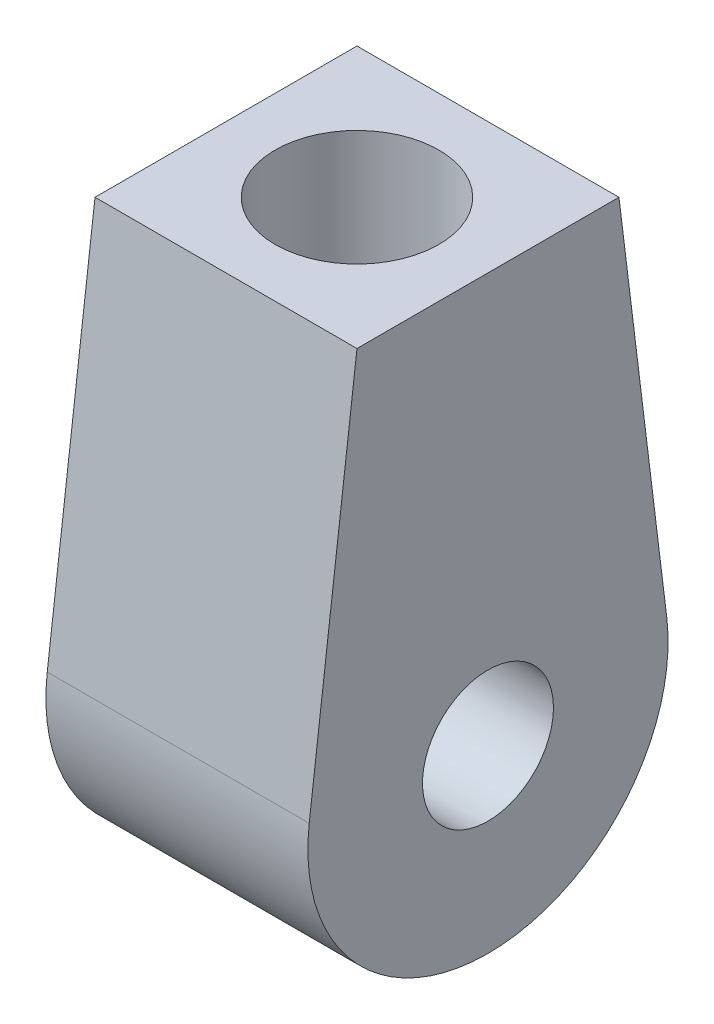
ISO-10303-21;
HEADER;
FILE_DESCRIPTION(('STEP AP214'),'2;1');
FILE_NAME('part.step','',(''),(''),'','','');
FILE_SCHEMA(('AUTOMOTIVE_DESIGN { 1 0 10303 214 1 1 1 1 }'));
ENDSEC;
DATA;
#1=APPLICATION_CONTEXT('core data for automotive mechanical design processes');
#2=APPLICATION_PROTOCOL_DEFINITION('international standard','automotive_design',2000,#1);
#3=PRODUCT_CONTEXT('',#1,'mechanical');
#4=PRODUCT('Part','Part','',(#3));
#5=PRODUCT_RELATED_PRODUCT_CATEGORY('part','',(#4));
#6=PRODUCT_DEFINITION_FORMATION('','',#4);
#7=PRODUCT_DEFINITION_CONTEXT('part definition',#1,'design');
#8=PRODUCT_DEFINITION('design','',#6,#7);
#9=PRODUCT_DEFINITION_SHAPE('','',#8);
#10=(LENGTH_UNIT() NAMED_UNIT(*) SI_UNIT(.MILLI.,.METRE.));
#11=(NAMED_UNIT(*) PLANE_ANGLE_UNIT() SI_UNIT($,.RADIAN.));
#12=(NAMED_UNIT(*) SI_UNIT($,.STERADIAN.) SOLID_ANGLE_UNIT());
#13=UNCERTAINTY_MEASURE_WITH_UNIT(LENGTH_MEASURE(1.E-05),#10,'distance_accuracy_value','');
#14=(GEOMETRIC_REPRESENTATION_CONTEXT(3) GLOBAL_UNCERTAINTY_ASSIGNED_CONTEXT((#13)) GLOBAL_UNIT_ASSIGNED_CONTEXT((#10,
#11,#12)) REPRESENTATION_CONTEXT('',''));
#15=CARTESIAN_POINT('',(0.,0.,0.));
#16=DIRECTION('',(0.,0.,1.));
#17=DIRECTION('',(1.,0.,0.));
#18=AXIS2_PLACEMENT_3D('',#15,#16,#17);
#19=CARTESIAN_POINT('',(32.,-14.0636303749307,52.859982056046));
#20=DIRECTION('',(1.,0.,0.));
#21=DIRECTION('',(0.,0.,-1.));
#22=AXIS2_PLACEMENT_3D('',#19,#20,#21);
#23=PLANE('',#22);
#24=CARTESIAN_POINT('',(32.,-14.0636303749307,52.859982056046));
#25=DIRECTION('',(1.,0.,0.));
#26=DIRECTION('',(0.,0.,-1.));
#27=AXIS2_PLACEMENT_3D('',#24,#25,#26);
#28=CIRCLE('',#27,22.);
#29=CARTESIAN_POINT('',(32.,-11.3706900285013,74.6945434734542));
#30=VERTEX_POINT('',#29);
#31=CARTESIAN_POINT('',(32.,-11.5720169459368,31.0015314586121));
#32=VERTEX_POINT('',#31);
#33=EDGE_CURVE('E98',#30,#32,#28,.T.);
#34=ORIENTED_EDGE('',*,*,#33,.T.);
#35=DIRECTION('',(0.,0.992482453038617,0.122387010791379));
#36=VECTOR('',#35,1.);
#37=CARTESIAN_POINT('',(32.,35.9363696250693,36.859982056046));
#38=LINE('',#37,#36);
#39=CARTESIAN_POINT('',(32.,35.9363696250693,36.859982056046));
#40=VERTEX_POINT('',#39);
#41=EDGE_CURVE('E93',#32,#40,#38,.T.);
#42=ORIENTED_EDGE('',*,*,#41,.T.);
#43=DIRECTION('',(0.,0.,1.));
#44=VECTOR('',#43,1.);
#45=CARTESIAN_POINT('',(32.,35.9363696250693,68.859982056046));
#46=LINE('',#45,#44);
#47=CARTESIAN_POINT('',(32.,35.9363696250693,68.859982056046));
#48=VERTEX_POINT('',#47);
#49=EDGE_CURVE('E96',#40,#48,#46,.T.);
#50=ORIENTED_EDGE('',*,*,#49,.T.);
#51=DIRECTION('',(0.,-0.992480064427648,0.122406379383152));
#52=VECTOR('',#51,1.);
#53=CARTESIAN_POINT('',(32.,-11.3706900285013,74.6945434734542));
#54=LINE('',#53,#52);
#55=EDGE_CURVE('E63',#48,#30,#54,.T.);
#56=ORIENTED_EDGE('',*,*,#55,.T.);
#57=EDGE_LOOP('',(#34,#42,#50,#56));
#58=FACE_BOUND('',#57,.T.);
#59=CARTESIAN_POINT('',(32.,-14.0636303749307,52.859982056046));
#60=DIRECTION('',(1.,0.,0.));
#61=DIRECTION('',(0.,0.,-1.));
#62=AXIS2_PLACEMENT_3D('',#59,#60,#61);
#63=CIRCLE('',#62,8.);
#64=CARTESIAN_POINT('',(32.,-14.0636303749307,44.859982056046));
#65=VERTEX_POINT('',#64);
#66=EDGE_CURVE('E118',#65,#65,#63,.T.);
#67=ORIENTED_EDGE('',*,*,#66,.F.);
#68=EDGE_LOOP('',(#67));
#69=FACE_BOUND('',#68,.T.);
#70=ADVANCED_FACE('F45',(#58,#69),#23,.T.);
#71=CARTESIAN_POINT('',(0.,-14.0636303749307,52.859982056046));
#72=DIRECTION('',(1.,0.,0.));
#73=DIRECTION('',(0.,0.,-1.));
#74=AXIS2_PLACEMENT_3D('',#71,#72,#73);
#75=PLANE('',#74);
#76=CARTESIAN_POINT('',(0.,-14.0636303749307,52.859982056046));
#77=DIRECTION('',(1.,0.,0.));
#78=DIRECTION('',(0.,0.,-1.));
#79=AXIS2_PLACEMENT_3D('',#76,#77,#78);
#80=CIRCLE('',#79,22.);
#81=CARTESIAN_POINT('',(0.,-11.3706900285013,74.6945434734542));
#82=VERTEX_POINT('',#81);
#83=CARTESIAN_POINT('',(0.,-11.5720169459368,31.0015314586121));
#84=VERTEX_POINT('',#83);
#85=EDGE_CURVE('E114',#82,#84,#80,.T.);
#86=ORIENTED_EDGE('',*,*,#85,.F.);
#87=DIRECTION('',(0.,-0.992480064427648,0.122406379383152));
#88=VECTOR('',#87,1.);
#89=CARTESIAN_POINT('',(0.,-11.3706900285013,74.6945434734542));
#90=LINE('',#89,#88);
#91=CARTESIAN_POINT('',(0.,35.9363696250693,68.859982056046));
#92=VERTEX_POINT('',#91);
#93=EDGE_CURVE('E86',#92,#82,#90,.T.);
#94=ORIENTED_EDGE('',*,*,#93,.F.);
#95=DIRECTION('',(0.,0.,1.));
#96=VECTOR('',#95,1.);
#97=CARTESIAN_POINT('',(0.,35.9363696250693,68.859982056046));
#98=LINE('',#97,#96);
#99=CARTESIAN_POINT('',(0.,35.9363696250693,36.859982056046));
#100=VERTEX_POINT('',#99);
#101=EDGE_CURVE('E80',#100,#92,#98,.T.);
#102=ORIENTED_EDGE('',*,*,#101,.F.);
#103=DIRECTION('',(0.,0.992482453038617,0.122387010791379));
#104=VECTOR('',#103,1.);
#105=CARTESIAN_POINT('',(0.,35.9363696250693,36.859982056046));
#106=LINE('',#105,#104);
#107=EDGE_CURVE('E103',#84,#100,#106,.T.);
#108=ORIENTED_EDGE('',*,*,#107,.F.);
#109=EDGE_LOOP('',(#86,#94,#102,#108));
#110=FACE_BOUND('',#109,.T.);
#111=CARTESIAN_POINT('',(0.,-14.0636303749307,52.859982056046));
#112=DIRECTION('',(1.,0.,0.));
#113=DIRECTION('',(0.,0.,-1.));
#114=AXIS2_PLACEMENT_3D('',#111,#112,#113);
#115=CIRCLE('',#114,8.);
#116=CARTESIAN_POINT('',(0.,-14.0636303749307,44.859982056046));
#117=VERTEX_POINT('',#116);
#118=EDGE_CURVE('E136',#117,#117,#115,.T.);
#119=ORIENTED_EDGE('',*,*,#118,.T.);
#120=EDGE_LOOP('',(#119));
#121=FACE_BOUND('',#120,.T.);
#122=ADVANCED_FACE('F131',(#110,#121),#75,.F.);
#123=CARTESIAN_POINT('',(32.,-14.0636303749307,52.859982056046));
#124=DIRECTION('',(-1.,0.,0.));
#125=DIRECTION('',(0.,0.,1.));
#126=AXIS2_PLACEMENT_3D('',#123,#124,#125);
#127=CYLINDRICAL_SURFACE('',#126,22.);
#128=ORIENTED_EDGE('',*,*,#85,.T.);
#129=DIRECTION('',(-1.,0.,0.));
#130=VECTOR('',#129,1.);
#131=CARTESIAN_POINT('',(32.,-11.5720169459368,31.0015314586121));
#132=LINE('',#131,#130);
#133=EDGE_CURVE('E11',#32,#84,#132,.T.);
#134=ORIENTED_EDGE('',*,*,#133,.F.);
#135=ORIENTED_EDGE('',*,*,#33,.F.);
#136=DIRECTION('',(-1.,0.,0.));
#137=VECTOR('',#136,1.);
#138=CARTESIAN_POINT('',(32.,-11.3706900285013,74.6945434734542));
#139=LINE('',#138,#137);
#140=EDGE_CURVE('E110',#30,#82,#139,.T.);
#141=ORIENTED_EDGE('',*,*,#140,.T.);
#142=EDGE_LOOP('',(#128,#134,#135,#141));
#143=FACE_BOUND('',#142,.T.);
#144=ADVANCED_FACE('F47',(#143),#127,.T.);
#145=CARTESIAN_POINT('',(32.,35.9363696250693,36.859982056046));
#146=DIRECTION('',(0.,-0.122387010791379,0.992482453038617));
#147=DIRECTION('',(0.,-0.992482453038617,-0.122387010791379));
#148=AXIS2_PLACEMENT_3D('',#145,#146,#147);
#149=PLANE('',#148);
#150=ORIENTED_EDGE('',*,*,#107,.T.);
#151=DIRECTION('',(-1.,0.,0.));
#152=VECTOR('',#151,1.);
#153=CARTESIAN_POINT('',(32.,35.9363696250693,36.859982056046));
#154=LINE('',#153,#152);
#155=EDGE_CURVE('E55',#40,#100,#154,.T.);
#156=ORIENTED_EDGE('',*,*,#155,.F.);
#157=ORIENTED_EDGE('',*,*,#41,.F.);
#158=ORIENTED_EDGE('',*,*,#133,.T.);
#159=EDGE_LOOP('',(#150,#156,#157,#158));
#160=FACE_BOUND('',#159,.T.);
#161=ADVANCED_FACE('F102',(#160),#149,.F.);
#162=CARTESIAN_POINT('',(32.,35.9363696250693,68.859982056046));
#163=DIRECTION('',(0.,-1.,0.));
#164=DIRECTION('',(0.,0.,-1.));
#165=AXIS2_PLACEMENT_3D('',#162,#163,#164);
#166=PLANE('',#165);
#167=CARTESIAN_POINT('',(16.,35.9363696250693,52.859982056046));
#168=DIRECTION('',(0.,1.,0.));
#169=DIRECTION('',(0.,0.,1.));
#170=AXIS2_PLACEMENT_3D('',#167,#168,#169);
#171=CIRCLE('',#170,10.);
#172=CARTESIAN_POINT('',(16.,35.9363696250693,62.859982056046));
#173=VERTEX_POINT('',#172);
#174=EDGE_CURVE('E144',#173,#173,#171,.T.);
#175=ORIENTED_EDGE('',*,*,#174,.F.);
#176=EDGE_LOOP('',(#175));
#177=FACE_BOUND('',#176,.T.);
#178=ORIENTED_EDGE('',*,*,#101,.T.);
#179=DIRECTION('',(-1.,0.,0.));
#180=VECTOR('',#179,1.);
#181=CARTESIAN_POINT('',(32.,35.9363696250693,68.859982056046));
#182=LINE('',#181,#180);
#183=EDGE_CURVE('E105',#48,#92,#182,.T.);
#184=ORIENTED_EDGE('',*,*,#183,.F.);
#185=ORIENTED_EDGE('',*,*,#49,.F.);
#186=ORIENTED_EDGE('',*,*,#155,.T.);
#187=EDGE_LOOP('',(#178,#184,#185,#186));
#188=FACE_BOUND('',#187,.T.);
#189=ADVANCED_FACE('F106',(#177,#188),#166,.F.);
#190=CARTESIAN_POINT('',(32.,-11.3706900285013,74.6945434734542));
#191=DIRECTION('',(0.,-0.122406379383152,-0.992480064427648));
#192=DIRECTION('',(0.,0.992480064427648,-0.122406379383152));
#193=AXIS2_PLACEMENT_3D('',#190,#191,#192);
#194=PLANE('',#193);
#195=ORIENTED_EDGE('',*,*,#93,.T.);
#196=ORIENTED_EDGE('',*,*,#140,.F.);
#197=ORIENTED_EDGE('',*,*,#55,.F.);
#198=ORIENTED_EDGE('',*,*,#183,.T.);
#199=EDGE_LOOP('',(#195,#196,#197,#198));
#200=FACE_BOUND('',#199,.T.);
#201=ADVANCED_FACE('F128',(#200),#194,.F.);
#202=CARTESIAN_POINT('',(32.,-14.0636303749307,52.859982056046));
#203=DIRECTION('',(-1.,0.,0.));
#204=DIRECTION('',(0.,0.,1.));
#205=AXIS2_PLACEMENT_3D('',#202,#203,#204);
#206=CYLINDRICAL_SURFACE('',#205,8.);
#207=ORIENTED_EDGE('',*,*,#66,.T.);
#208=EDGE_LOOP('',(#207));
#209=FACE_BOUND('',#208,.T.);
#210=ORIENTED_EDGE('',*,*,#118,.F.);
#211=EDGE_LOOP('',(#210));
#212=FACE_BOUND('',#211,.T.);
#213=ADVANCED_FACE('F157',(#209,#212),#206,.F.);
#214=CARTESIAN_POINT('',(16.,-2.06363037493068,52.859982056046));
#215=DIRECTION('',(0.,1.,0.));
#216=DIRECTION('',(0.,0.,1.));
#217=AXIS2_PLACEMENT_3D('',#214,#215,#216);
#218=CYLINDRICAL_SURFACE('',#217,10.);
#219=CARTESIAN_POINT('',(16.,-2.06363037493068,52.859982056046));
#220=DIRECTION('',(0.,1.,0.));
#221=DIRECTION('',(0.,0.,1.));
#222=AXIS2_PLACEMENT_3D('',#219,#220,#221);
#223=CIRCLE('',#222,10.);
#224=CARTESIAN_POINT('',(16.,-2.06363037493068,62.859982056046));
#225=VERTEX_POINT('',#224);
#226=EDGE_CURVE('E140',#225,#225,#223,.T.);
#227=ORIENTED_EDGE('',*,*,#226,.F.);
#228=EDGE_LOOP('',(#227));
#229=FACE_BOUND('',#228,.T.);
#230=ORIENTED_EDGE('',*,*,#174,.T.);
#231=EDGE_LOOP('',(#230));
#232=FACE_BOUND('',#231,.T.);
#233=ADVANCED_FACE('F154',(#229,#232),#218,.F.);
#234=CARTESIAN_POINT('',(16.,-2.06363037493068,52.859982056046));
#235=DIRECTION('',(0.,1.,0.));
#236=DIRECTION('',(0.,0.,1.));
#237=AXIS2_PLACEMENT_3D('',#234,#235,#236);
#238=PLANE('',#237);
#239=ORIENTED_EDGE('',*,*,#226,.T.);
#240=EDGE_LOOP('',(#239));
#241=FACE_BOUND('',#240,.T.);
#242=ADVANCED_FACE('F152',(#241),#238,.T.);
#243=CLOSED_SHELL('',(#70,#122,#144,#161,#189,#201,#213,#233,#242));
#244=MANIFOLD_SOLID_BREP('B2',#243);
#245=ADVANCED_BREP_SHAPE_REPRESENTATION('',(#18,#244),#14);
#246=SHAPE_DEFINITION_REPRESENTATION(#9,#245);
ENDSEC;
END-ISO-10303-21;
